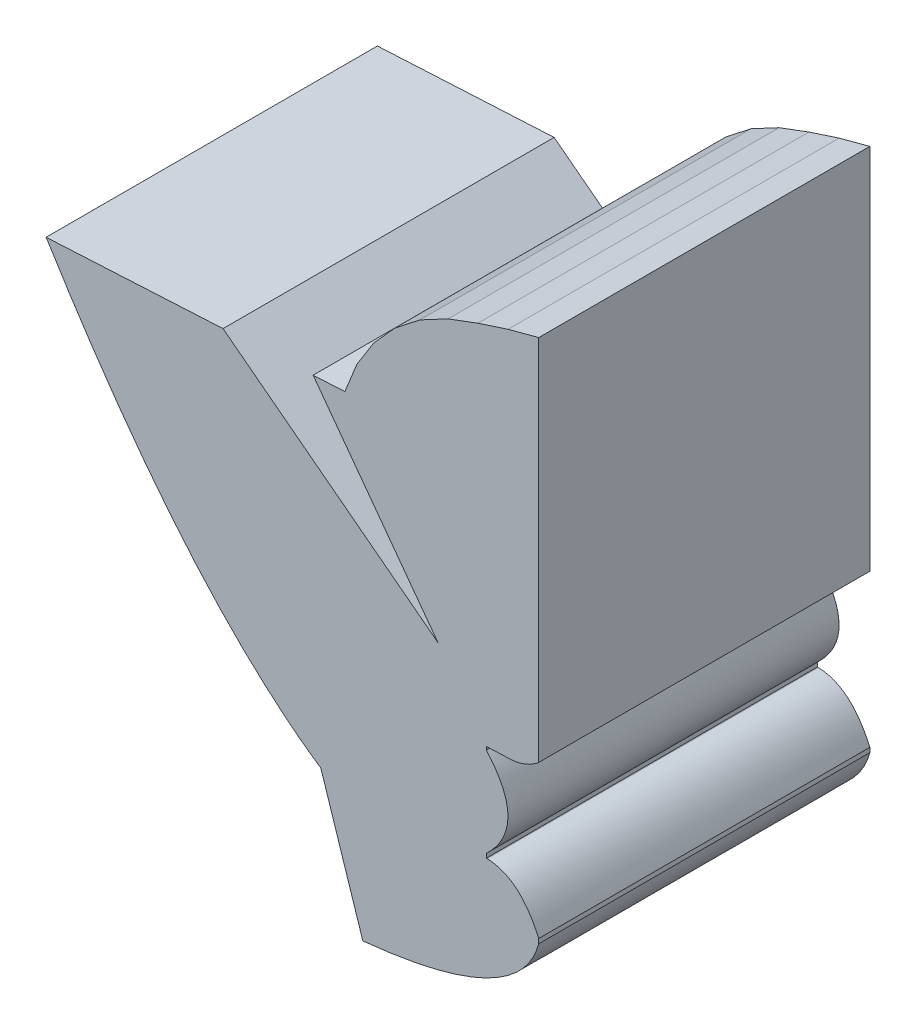
ISO-10303-21;
HEADER;
FILE_DESCRIPTION(('STEP AP214'),'2;1');
FILE_NAME('part.step','',(''),(''),'','','');
FILE_SCHEMA(('AUTOMOTIVE_DESIGN { 1 0 10303 214 1 1 1 1 }'));
ENDSEC;
DATA;
#1=APPLICATION_CONTEXT('core data for automotive mechanical design processes');
#2=APPLICATION_PROTOCOL_DEFINITION('international standard','automotive_design',2000,#1);
#3=PRODUCT_CONTEXT('',#1,'mechanical');
#4=PRODUCT('Part','Part','',(#3));
#5=PRODUCT_RELATED_PRODUCT_CATEGORY('part','',(#4));
#6=PRODUCT_DEFINITION_FORMATION('','',#4);
#7=PRODUCT_DEFINITION_CONTEXT('part definition',#1,'design');
#8=PRODUCT_DEFINITION('design','',#6,#7);
#9=PRODUCT_DEFINITION_SHAPE('','',#8);
#10=(LENGTH_UNIT() NAMED_UNIT(*) SI_UNIT(.MILLI.,.METRE.));
#11=(NAMED_UNIT(*) PLANE_ANGLE_UNIT() SI_UNIT($,.RADIAN.));
#12=(NAMED_UNIT(*) SI_UNIT($,.STERADIAN.) SOLID_ANGLE_UNIT());
#13=UNCERTAINTY_MEASURE_WITH_UNIT(LENGTH_MEASURE(1.E-05),#10,'distance_accuracy_value','');
#14=(GEOMETRIC_REPRESENTATION_CONTEXT(3) GLOBAL_UNCERTAINTY_ASSIGNED_CONTEXT((#13)) GLOBAL_UNIT_ASSIGNED_CONTEXT((#10,
#11,#12)) REPRESENTATION_CONTEXT('',''));
#15=CARTESIAN_POINT('',(0.,0.,0.));
#16=DIRECTION('',(0.,0.,1.));
#17=DIRECTION('',(1.,0.,0.));
#18=AXIS2_PLACEMENT_3D('',#15,#16,#17);
#19=CARTESIAN_POINT('',(-2.17733041778456,0.,7.21));
#20=DIRECTION('',(1.,0.,0.));
#21=DIRECTION('',(0.,1.,0.));
#22=AXIS2_PLACEMENT_3D('',#19,#20,#21);
#23=PLANE('',#22);
#24=DIRECTION('',(0.,1.,0.));
#25=VECTOR('',#24,1.);
#26=CARTESIAN_POINT('',(-2.17733041778456,0.,7.21));
#27=LINE('',#26,#25);
#28=CARTESIAN_POINT('',(-2.17733041779455,-1.68817652024789,7.21));
#29=VERTEX_POINT('',#28);
#30=CARTESIAN_POINT('',(-2.17733041778456,-1.87023854064238,7.21));
#31=VERTEX_POINT('',#30);
#32=EDGE_CURVE('E599',#29,#31,#27,.F.);
#33=ORIENTED_EDGE('',*,*,#32,.T.);
#34=DIRECTION('',(0.,0.,-1.));
#35=VECTOR('',#34,1.);
#36=CARTESIAN_POINT('',(-2.17733041778456,-1.87023854064238,7.21));
#37=LINE('',#36,#35);
#38=CARTESIAN_POINT('',(-2.17733041778456,-1.87023854064238,-7.21));
#39=VERTEX_POINT('',#38);
#40=EDGE_CURVE('E13',#31,#39,#37,.T.);
#41=ORIENTED_EDGE('',*,*,#40,.T.);
#42=DIRECTION('',(0.,1.,0.));
#43=VECTOR('',#42,1.);
#44=CARTESIAN_POINT('',(-2.17733041778456,0.,-7.21));
#45=LINE('',#44,#43);
#46=CARTESIAN_POINT('',(-2.17733041778456,-1.68817652020115,-7.21));
#47=VERTEX_POINT('',#46);
#48=EDGE_CURVE('E238',#47,#39,#45,.F.);
#49=ORIENTED_EDGE('',*,*,#48,.F.);
#50=DIRECTION('',(0.,0.,-1.));
#51=VECTOR('',#50,1.);
#52=CARTESIAN_POINT('',(-2.17733041778328,-1.68817652023794,33.5462369436587));
#53=LINE('',#52,#51);
#54=EDGE_CURVE('E693',#29,#47,#53,.T.);
#55=ORIENTED_EDGE('',*,*,#54,.F.);
#56=EDGE_LOOP('',(#33,#41,#49,#55));
#57=FACE_BOUND('',#56,.T.);
#58=ADVANCED_FACE('F59',(#57),#23,.T.);
#59=CARTESIAN_POINT('',(-82931.1005830976,996560.072871644,33.5462369436587));
#60=CARTESIAN_POINT('',(87153.8887538027,-996199.093812144,33.5462369436587));
#61=CARTESIAN_POINT('',(-91384.0928999308,995820.531871049,33.5462369436587));
#62=B_SPLINE_CURVE_WITH_KNOTS('',2,(#59,#60,#61),.UNSPECIFIED.,.F.,.F.,(3,3),(0.,1.),.UNSPECIFIED.);
#63=DIRECTION('',(0.,0.,-1.));
#64=VECTOR('',#63,1.);
#65=SURFACE_OF_LINEAR_EXTRUSION('',#62,#64);
#66=CARTESIAN_POINT('',(-10.3360060172452,-1.39847805122074,-7.21));
#67=CARTESIAN_POINT('',(-9.86107716648297,-1.76023759043423,-7.21));
#68=CARTESIAN_POINT('',(-9.38992513536285,-2.07882788360003,-7.21));
#69=B_SPLINE_CURVE_WITH_KNOTS('',2,(#66,#67,#68),.UNSPECIFIED.,.F.,.F.,(3,3),(0.500860940724971,
0.500965025000386),.UNSPECIFIED.);
#70=CARTESIAN_POINT('',(-10.3360060157351,-1.39847805238491,-7.21253661762446));
#71=VERTEX_POINT('',#70);
#72=CARTESIAN_POINT('',(-9.38992513448754,-2.07882788384246,-7.21));
#73=VERTEX_POINT('',#72);
#74=EDGE_CURVE('E627',#71,#73,#69,.T.);
#75=ORIENTED_EDGE('',*,*,#74,.T.);
#76=DIRECTION('',(0.,0.,-1.));
#77=VECTOR('',#76,1.);
#78=CARTESIAN_POINT('',(-9.38992513433434,-2.07882788430969,0.));
#79=LINE('',#78,#77);
#80=CARTESIAN_POINT('',(-9.38992513537839,-2.07882788359217,7.21));
#81=VERTEX_POINT('',#80);
#82=EDGE_CURVE('E61',#73,#81,#79,.F.);
#83=ORIENTED_EDGE('',*,*,#82,.T.);
#84=CARTESIAN_POINT('',(-9.38992513537751,-2.07882788359004,7.21));
#85=CARTESIAN_POINT('',(-9.86107716655748,-1.76023759038315,7.21));
#86=CARTESIAN_POINT('',(-10.3360060173805,-1.39847805111761,7.21));
#87=B_SPLINE_CURVE_WITH_KNOTS('',2,(#84,#85,#86),.UNSPECIFIED.,.F.,.F.,(3,3),(0.500860940724973,
0.500965025000401),.UNSPECIFIED.);
#88=CARTESIAN_POINT('',(-10.3360060166126,-1.39847805171673,7.21251805157951));
#89=VERTEX_POINT('',#88);
#90=EDGE_CURVE('E557',#89,#81,#87,.F.);
#91=ORIENTED_EDGE('',*,*,#90,.F.);
#92=CARTESIAN_POINT('',(-10.336006015861,-1.39847805228632,7.21));
#93=CARTESIAN_POINT('',(-10.6228848167366,-1.17995870432205,7.21));
#94=CARTESIAN_POINT('',(-10.9111416710362,-0.945688133646021,7.21));
#95=B_SPLINE_CURVE_WITH_KNOTS('',2,(#92,#93,#94),.UNSPECIFIED.,.F.,.F.,(3,3),(0.500965025000234,
0.501027896674745),.UNSPECIFIED.);
#96=CARTESIAN_POINT('',(-10.9111416711017,-0.945688133589869,7.21251805157951));
#97=VERTEX_POINT('',#96);
#98=EDGE_CURVE('E503',#97,#89,#95,.F.);
#99=ORIENTED_EDGE('',*,*,#98,.F.);
#100=CARTESIAN_POINT('',(-10.9111416711622,-0.945688133537792,7.21));
#101=CARTESIAN_POINT('',(-15.9223301717882,3.1269782135513,7.20999999999999));
#102=CARTESIAN_POINT('',(-21.3499930113534,11.9599680374731,7.20999999999999));
#103=B_SPLINE_CURVE_WITH_KNOTS('',2,(#100,#101,#102),.UNSPECIFIED.,.F.,.F.,(3,3),
(0.50102789667476,0.50212088651222),.UNSPECIFIED.);
#104=CARTESIAN_POINT('',(-21.3499930113618,11.9599680374759,7.21251805157951));
#105=VERTEX_POINT('',#104);
#106=EDGE_CURVE('E571',#105,#97,#103,.F.);
#107=ORIENTED_EDGE('',*,*,#106,.F.);
#108=DIRECTION('',(0.,0.,1.));
#109=VECTOR('',#108,1.);
#110=CARTESIAN_POINT('',(-21.3499930113609,11.9599680374713,-7.21507323524891));
#111=LINE('',#110,#109);
#112=CARTESIAN_POINT('',(-21.3499930113604,11.959968037476,-7.21253661762445));
#113=VERTEX_POINT('',#112);
#114=EDGE_CURVE('E647',#113,#105,#111,.T.);
#115=ORIENTED_EDGE('',*,*,#114,.F.);
#116=CARTESIAN_POINT('',(-21.3499930113554,11.9599680374539,-7.21));
#117=CARTESIAN_POINT('',(-15.9223301719088,3.12697821372485,-7.21));
#118=CARTESIAN_POINT('',(-10.9111416713832,-0.945688133379363,-7.21));
#119=B_SPLINE_CURVE_WITH_KNOTS('',2,(#116,#117,#118),.UNSPECIFIED.,.F.,.F.,(3,3),
(0.501027896674784,0.50212088651222),.UNSPECIFIED.);
#120=CARTESIAN_POINT('',(-10.9111416712647,-0.945688133456589,-7.21253661762446));
#121=VERTEX_POINT('',#120);
#122=EDGE_CURVE('E550',#113,#121,#119,.T.);
#123=ORIENTED_EDGE('',*,*,#122,.T.);
#124=CARTESIAN_POINT('',(-10.9111416712668,-0.945688133461656,-7.21));
#125=CARTESIAN_POINT('',(-10.622884816787,-1.17995870429009,-7.21));
#126=CARTESIAN_POINT('',(-10.3360060157329,-1.39847805238713,-7.21));
#127=B_SPLINE_CURVE_WITH_KNOTS('',2,(#124,#125,#126),.UNSPECIFIED.,.F.,.F.,(3,3),
(0.50096502500022,0.501027896674771),.UNSPECIFIED.);
#128=EDGE_CURVE('E493',#121,#71,#127,.T.);
#129=ORIENTED_EDGE('',*,*,#128,.T.);
#130=EDGE_LOOP('',(#75,#83,#91,#99,#107,#115,#123,#129));
#131=FACE_BOUND('',#130,.T.);
#132=ADVANCED_FACE('F463',(#131),#65,.T.);
#133=DIRECTION('',(0.,1.,0.));
#134=VECTOR('',#133,1.);
#135=CARTESIAN_POINT('',(-2.17733041778456,0.,-7.21));
#136=LINE('',#135,#134);
#137=CARTESIAN_POINT('',(-2.17733041778456,2.34248700715526,-7.21));
#138=VERTEX_POINT('',#137);
#139=CARTESIAN_POINT('',(-2.17733041777607,2.20172974209443,-7.21));
#140=VERTEX_POINT('',#139);
#141=EDGE_CURVE('E582',#138,#140,#136,.F.);
#142=ORIENTED_EDGE('',*,*,#141,.F.);
#143=DIRECTION('',(0.,0.,-1.));
#144=VECTOR('',#143,1.);
#145=CARTESIAN_POINT('',(-2.17733041778456,2.34248700715526,26.4637698053972));
#146=LINE('',#145,#144);
#147=CARTESIAN_POINT('',(-2.17733041778456,2.34248700715526,7.21));
#148=VERTEX_POINT('',#147);
#149=EDGE_CURVE('E387',#148,#138,#146,.T.);
#150=ORIENTED_EDGE('',*,*,#149,.F.);
#151=DIRECTION('',(0.,1.,0.));
#152=VECTOR('',#151,1.);
#153=CARTESIAN_POINT('',(-2.17733041778456,0.,7.21));
#154=LINE('',#153,#152);
#155=CARTESIAN_POINT('',(-2.17733041778074,2.20172974210003,7.21));
#156=VERTEX_POINT('',#155);
#157=EDGE_CURVE('E591',#148,#156,#154,.F.);
#158=ORIENTED_EDGE('',*,*,#157,.T.);
#159=DIRECTION('',(0.,0.,-1.));
#160=VECTOR('',#159,1.);
#161=CARTESIAN_POINT('',(-2.17733041778074,2.20172974210003,33.5462369436587));
#162=LINE('',#161,#160);
#163=EDGE_CURVE('E692',#156,#140,#162,.T.);
#164=ORIENTED_EDGE('',*,*,#163,.T.);
#165=EDGE_LOOP('',(#142,#150,#158,#164));
#166=FACE_BOUND('',#165,.T.);
#167=ADVANCED_FACE('F456',(#166),#23,.T.);
#168=CARTESIAN_POINT('',(-13.6496127625312,12.3635278659567,-7.21507323524891));
#169=DIRECTION('',(0.607599018477342,0.794243937808386,0.));
#170=DIRECTION('',(-0.794243937808386,0.607599018477342,0.));
#171=AXIS2_PLACEMENT_3D('',#168,#169,#170);
#172=PLANE('',#171);
#173=DIRECTION('',(-0.794243937808386,0.607599018477342,0.));
#174=VECTOR('',#173,1.);
#175=CARTESIAN_POINT('',(-2.17733041778456,3.58719711850737,7.21));
#176=LINE('',#175,#174);
#177=CARTESIAN_POINT('',(-4.28688263587392,5.20101095594709,7.21));
#178=VERTEX_POINT('',#177);
#179=CARTESIAN_POINT('',(-13.6496127625312,12.3635278659567,7.21));
#180=VERTEX_POINT('',#179);
#181=EDGE_CURVE('E326',#178,#180,#176,.T.);
#182=ORIENTED_EDGE('',*,*,#181,.F.);
#183=DIRECTION('',(0.,0.,-1.));
#184=VECTOR('',#183,1.);
#185=CARTESIAN_POINT('',(-4.28688263587392,5.2010109559471,-7.21507323524891));
#186=LINE('',#185,#184);
#187=CARTESIAN_POINT('',(-4.28688263587394,5.20101095594711,-7.21));
#188=VERTEX_POINT('',#187);
#189=EDGE_CURVE('E592',#178,#188,#186,.T.);
#190=ORIENTED_EDGE('',*,*,#189,.T.);
#191=DIRECTION('',(-0.794243937808386,0.607599018477342,0.));
#192=VECTOR('',#191,1.);
#193=CARTESIAN_POINT('',(0.927296805871271,1.21214788736496,-7.21));
#194=LINE('',#193,#192);
#195=CARTESIAN_POINT('',(-13.6496127625312,12.3635278659567,-7.21));
#196=VERTEX_POINT('',#195);
#197=EDGE_CURVE('E574',#188,#196,#194,.T.);
#198=ORIENTED_EDGE('',*,*,#197,.T.);
#199=DIRECTION('',(0.,0.,1.));
#200=VECTOR('',#199,1.);
#201=CARTESIAN_POINT('',(-13.6496127625312,12.3635278659567,-7.21507323524891));
#202=LINE('',#201,#200);
#203=EDGE_CURVE('E397',#196,#180,#202,.T.);
#204=ORIENTED_EDGE('',*,*,#203,.T.);
#205=EDGE_LOOP('',(#182,#190,#198,#204));
#206=FACE_BOUND('',#205,.T.);
#207=ADVANCED_FACE('F451',(#206),#172,.T.);
#208=CARTESIAN_POINT('',(-0.683557287645435,13.0430500394562,7.21));
#209=DIRECTION('',(0.0523359562429403,-0.998629534754574,0.));
#210=DIRECTION('',(0.998629534754574,0.0523359562429403,0.));
#211=AXIS2_PLACEMENT_3D('',#208,#209,#210);
#212=PLANE('',#211);
#213=ORIENTED_EDGE('',*,*,#203,.F.);
#214=DIRECTION('',(0.998629534754574,0.0523359562429403,0.));
#215=VECTOR('',#214,1.);
#216=CARTESIAN_POINT('',(-0.683557287645435,13.0430500394562,-7.21));
#217=LINE('',#216,#215);
#218=EDGE_CURVE('E590',#196,#113,#217,.F.);
#219=ORIENTED_EDGE('',*,*,#218,.T.);
#220=ORIENTED_EDGE('',*,*,#114,.T.);
#221=DIRECTION('',(-0.998629534754574,-0.0523359562429403,0.));
#222=VECTOR('',#221,1.);
#223=CARTESIAN_POINT('',(-8.98184569452944,12.6081551722012,7.21));
#224=LINE('',#223,#222);
#225=EDGE_CURVE('E596',#180,#105,#224,.T.);
#226=ORIENTED_EDGE('',*,*,#225,.F.);
#227=EDGE_LOOP('',(#213,#219,#220,#226));
#228=FACE_BOUND('',#227,.T.);
#229=ADVANCED_FACE('F460',(#228),#212,.F.);
#230=CARTESIAN_POINT('',(0.,0.,7.21));
#231=DIRECTION('',(0.,0.,1.));
#232=DIRECTION('',(1.,0.,0.));
#233=AXIS2_PLACEMENT_3D('',#230,#231,#232);
#234=PLANE('',#233);
#235=ORIENTED_EDGE('',*,*,#90,.T.);
#236=DIRECTION('',(0.310244434689086,-0.950656820700535,0.));
#237=VECTOR('',#236,1.);
#238=CARTESIAN_POINT('',(-10.0196416475403,-0.149238723471877,7.21));
#239=LINE('',#238,#237);
#240=CARTESIAN_POINT('',(-7.56050506337814,-7.6845712077139,7.21));
#241=VERTEX_POINT('',#240);
#242=EDGE_CURVE('E74',#81,#241,#239,.T.);
#243=ORIENTED_EDGE('',*,*,#242,.T.);
#244=CARTESIAN_POINT('',(-933106.759380235,359603.535751917,7.21));
#245=CARTESIAN_POINT('',(932220.302324774,-361895.565336198,7.21));
#246=CARTESIAN_POINT('',(-931333.861410854,364170.463908804,7.21));
#247=B_SPLINE_CURVE_WITH_KNOTS('',2,(#244,#245,#246),.UNSPECIFIED.,.F.,.F.,(3,3),(0.,1.),.UNSPECIFIED.);
#248=CARTESIAN_POINT('',(0.100000006212991,-3.96279092132878,7.21));
#249=VERTEX_POINT('',#248);
#250=EDGE_CURVE('E261',#241,#249,#247,.T.);
#251=ORIENTED_EDGE('',*,*,#250,.T.);
#252=DIRECTION('',(2.22058157456749E-12,1.,0.));
#253=VECTOR('',#252,1.);
#254=CARTESIAN_POINT('',(0.100000000000933,-3.76279094455367,7.21));
#255=LINE('',#254,#253);
#256=CARTESIAN_POINT('',(0.100000000000933,-3.76279094455367,7.21));
#257=VERTEX_POINT('',#256);
#258=EDGE_CURVE('E720',#249,#257,#255,.T.);
#259=ORIENTED_EDGE('',*,*,#258,.T.);
#260=CARTESIAN_POINT('',(-340142.258084091,-940378.661072562,7.21));
#261=CARTESIAN_POINT('',(342018.643325663,939690.620785911,7.21));
#262=CARTESIAN_POINT('',(-343901.028567235,-939010.58049926,7.21));
#263=B_SPLINE_CURVE_WITH_KNOTS('',2,(#260,#261,#262),.UNSPECIFIED.,.F.,.F.,(3,3),(0.,1.),.UNSPECIFIED.);
#264=CARTESIAN_POINT('',(-2.14675730902949,-1.87694782736109,7.21));
#265=VERTEX_POINT('',#264);
#266=EDGE_CURVE('E719',#257,#265,#263,.T.);
#267=ORIENTED_EDGE('',*,*,#266,.T.);
#268=DIRECTION('',(-0.976756943268694,0.21434988634566,0.));
#269=VECTOR('',#268,1.);
#270=CARTESIAN_POINT('',(-2.14675730902949,-1.87694782736109,7.21));
#271=LINE('',#270,#269);
#272=EDGE_CURVE('E246',#265,#31,#271,.T.);
#273=ORIENTED_EDGE('',*,*,#272,.T.);
#274=ORIENTED_EDGE('',*,*,#32,.F.);
#275=CARTESIAN_POINT('',(-2.17733041777607,2.20172974209443,7.21));
#276=CARTESIAN_POINT('',(-0.307419303310444,0.0931805865995528,7.21));
#277=CARTESIAN_POINT('',(-2.17733041779435,-1.68817652026,7.21));
#278=B_SPLINE_CURVE_WITH_KNOTS('',2,(#275,#276,#277),.UNSPECIFIED.,.F.,.F.,(3,3),
(0.49947186766891,0.500440643667569),.UNSPECIFIED.);
#279=EDGE_CURVE('E688',#156,#29,#278,.T.);
#280=ORIENTED_EDGE('',*,*,#279,.F.);
#281=ORIENTED_EDGE('',*,*,#157,.F.);
#282=DIRECTION('',(0.999390827019096,0.0348994967025048,0.));
#283=VECTOR('',#282,1.);
#284=CARTESIAN_POINT('',(-2.17733041778456,2.34248700715526,7.21));
#285=LINE('',#284,#283);
#286=CARTESIAN_POINT('',(-1.19050164048462,2.37694782742692,7.21));
#287=VERTEX_POINT('',#286);
#288=EDGE_CURVE('E328',#148,#287,#285,.T.);
#289=ORIENTED_EDGE('',*,*,#288,.T.);
#290=CARTESIAN_POINT('',(-343900.072311573,939011.080499257,7.21));
#291=CARTESIAN_POINT('',(342019.599581338,-939690.120785908,7.21));
#292=CARTESIAN_POINT('',(-340141.301828429,940379.16107256,7.21));
#293=B_SPLINE_CURVE_WITH_KNOTS('',2,(#290,#291,#292),.UNSPECIFIED.,.F.,.F.,(3,3),(0.,1.),.UNSPECIFIED.);
#294=CARTESIAN_POINT('',(0.100000000004221,2.87767341815847,7.21));
#295=VERTEX_POINT('',#294);
#296=EDGE_CURVE('E325',#287,#295,#293,.T.);
#297=ORIENTED_EDGE('',*,*,#296,.T.);
#298=DIRECTION('',(0.,1.,0.));
#299=VECTOR('',#298,1.);
#300=CARTESIAN_POINT('',(0.100000000004221,2.87767341815847,7.21));
#301=LINE('',#300,#299);
#302=CARTESIAN_POINT('',(0.100000000004749,18.901056981292,7.21));
#303=VERTEX_POINT('',#302);
#304=EDGE_CURVE('E366',#295,#303,#301,.T.);
#305=ORIENTED_EDGE('',*,*,#304,.T.);
#306=DIRECTION('',(-0.965925826289069,-0.258819045102517,0.));
#307=VECTOR('',#306,1.);
#308=CARTESIAN_POINT('',(-1.23717113969405,18.5427630542675,7.21));
#309=LINE('',#308,#307);
#310=CARTESIAN_POINT('',(-1.23717113969405,18.5427630542675,7.21));
#311=VERTEX_POINT('',#310);
#312=EDGE_CURVE('E361',#303,#311,#309,.T.);
#313=ORIENTED_EDGE('',*,*,#312,.T.);
#314=DIRECTION('',(-0.951056516295155,-0.309016994374945,0.));
#315=VECTOR('',#314,1.);
#316=CARTESIAN_POINT('',(-2.55375807753184,18.114978026361,7.21));
#317=LINE('',#316,#315);
#318=CARTESIAN_POINT('',(-2.55375807753184,18.114978026361,7.21));
#319=VERTEX_POINT('',#318);
#320=EDGE_CURVE('E359',#311,#319,#317,.T.);
#321=ORIENTED_EDGE('',*,*,#320,.T.);
#322=DIRECTION('',(-0.9366721892484,-0.35020738125946,0.));
#323=VECTOR('',#322,1.);
#324=CARTESIAN_POINT('',(-3.85043219549524,17.63017143937,7.21));
#325=LINE('',#324,#323);
#326=CARTESIAN_POINT('',(-3.85043219549524,17.63017143937,7.21));
#327=VERTEX_POINT('',#326);
#328=EDGE_CURVE('E357',#319,#327,#325,.T.);
#329=ORIENTED_EDGE('',*,*,#328,.T.);
#330=DIRECTION('',(-0.882947592859008,-0.469471562785738,0.));
#331=VECTOR('',#330,1.);
#332=CARTESIAN_POINT('',(-5.07273312886345,16.9802625047698,7.21));
#333=LINE('',#332,#331);
#334=CARTESIAN_POINT('',(-5.07273312886345,16.9802625047698,7.21));
#335=VERTEX_POINT('',#334);
#336=EDGE_CURVE('E353',#327,#335,#333,.T.);
#337=ORIENTED_EDGE('',*,*,#336,.T.);
#338=DIRECTION('',(-0.788010753606726,-0.615661475325653,0.));
#339=VECTOR('',#338,1.);
#340=CARTESIAN_POINT('',(-6.1636090624156,16.1279768175834,7.21));
#341=LINE('',#340,#339);
#342=CARTESIAN_POINT('',(-6.1636090624156,16.1279768175834,7.21));
#343=VERTEX_POINT('',#342);
#344=EDGE_CURVE('E351',#335,#343,#341,.T.);
#345=ORIENTED_EDGE('',*,*,#344,.T.);
#346=DIRECTION('',(-0.669130606358526,-0.743144825477693,0.));
#347=VECTOR('',#346,1.);
#348=CARTESIAN_POINT('',(-7.08991428292019,15.0992106471385,7.21));
#349=LINE('',#348,#347);
#350=CARTESIAN_POINT('',(-7.08991428292019,15.0992106471385,7.21));
#351=VERTEX_POINT('',#350);
#352=EDGE_CURVE('E350',#343,#351,#349,.T.);
#353=ORIENTED_EDGE('',*,*,#352,.T.);
#354=DIRECTION('',(-0.52991926423321,-0.848048096156423,0.));
#355=VECTOR('',#354,1.);
#356=CARTESIAN_POINT('',(-7.82350347498618,13.925222532944,7.21));
#357=LINE('',#356,#355);
#358=CARTESIAN_POINT('',(-7.82350347498618,13.925222532944,7.21));
#359=VERTEX_POINT('',#358);
#360=EDGE_CURVE('E341',#351,#359,#357,.T.);
#361=ORIENTED_EDGE('',*,*,#360,.T.);
#362=DIRECTION('',(-0.374606593415918,-0.927183854566785,0.));
#363=VECTOR('',#362,1.);
#364=CARTESIAN_POINT('',(-8.34208690222621,12.6416835097826,7.21));
#365=LINE('',#364,#363);
#366=CARTESIAN_POINT('',(-8.34208690222621,12.6416835097826,7.21));
#367=VERTEX_POINT('',#366);
#368=EDGE_CURVE('E344',#359,#367,#365,.T.);
#369=ORIENTED_EDGE('',*,*,#368,.T.);
#370=DIRECTION('',(-0.998629534754663,-0.0523359562412363,0.));
#371=VECTOR('',#370,1.);
#372=CARTESIAN_POINT('',(-9.72453114050486,12.5692326772742,7.21));
#373=LINE('',#372,#371);
#374=CARTESIAN_POINT('',(-9.72453114050486,12.5692326772742,7.21));
#375=VERTEX_POINT('',#374);
#376=EDGE_CURVE('E339',#367,#375,#373,.T.);
#377=ORIENTED_EDGE('',*,*,#376,.T.);
#378=DIRECTION('',(0.593795682495491,-0.804615863284906,0.));
#379=VECTOR('',#378,1.);
#380=CARTESIAN_POINT('',(-9.72453114050486,12.5692326772742,7.21));
#381=LINE('',#380,#379);
#382=EDGE_CURVE('E337',#375,#178,#381,.T.);
#383=ORIENTED_EDGE('',*,*,#382,.T.);
#384=ORIENTED_EDGE('',*,*,#181,.T.);
#385=ORIENTED_EDGE('',*,*,#225,.T.);
#386=ORIENTED_EDGE('',*,*,#106,.T.);
#387=ORIENTED_EDGE('',*,*,#98,.T.);
#388=EDGE_LOOP('',(#235,#243,#251,#259,#267,#273,#274,#280,#281,#289,#297,#305,#313,#321,#329,
#337,#345,#353,#361,#369,#377,#383,#384,#385,#386,#387));
#389=FACE_BOUND('',#388,.T.);
#390=ADVANCED_FACE('F528',(#389),#234,.T.);
#391=CARTESIAN_POINT('',(0.,0.,-7.21));
#392=DIRECTION('',(0.,0.,1.));
#393=DIRECTION('',(1.,0.,0.));
#394=AXIS2_PLACEMENT_3D('',#391,#392,#393);
#395=PLANE('',#394);
#396=ORIENTED_EDGE('',*,*,#48,.T.);
#397=DIRECTION('',(0.976756943268694,-0.21434988634566,0.));
#398=VECTOR('',#397,1.);
#399=CARTESIAN_POINT('',(-2.14675730902949,-1.87694782736109,-7.21));
#400=LINE('',#399,#398);
#401=CARTESIAN_POINT('',(-2.14675730902949,-1.87694782736109,-7.21));
#402=VERTEX_POINT('',#401);
#403=EDGE_CURVE('E229',#39,#402,#400,.T.);
#404=ORIENTED_EDGE('',*,*,#403,.T.);
#405=CARTESIAN_POINT('',(-340142.258084091,-940378.661072562,-7.21));
#406=CARTESIAN_POINT('',(342018.643325663,939690.620785911,-7.21));
#407=CARTESIAN_POINT('',(-343901.028567235,-939010.58049926,-7.21));
#408=B_SPLINE_CURVE_WITH_KNOTS('',2,(#405,#406,#407),.UNSPECIFIED.,.F.,.F.,(3,3),(0.,1.),.UNSPECIFIED.);
#409=CARTESIAN_POINT('',(0.100000000000933,-3.76279094455367,-7.21));
#410=VERTEX_POINT('',#409);
#411=EDGE_CURVE('E232',#402,#410,#408,.F.);
#412=ORIENTED_EDGE('',*,*,#411,.T.);
#413=DIRECTION('',(-2.22058157456749E-12,-1.,0.));
#414=VECTOR('',#413,1.);
#415=CARTESIAN_POINT('',(0.100000000000933,-3.76279094455367,-7.21));
#416=LINE('',#415,#414);
#417=CARTESIAN_POINT('',(0.100000006214185,-3.96279092132124,-7.21));
#418=VERTEX_POINT('',#417);
#419=EDGE_CURVE('E254',#410,#418,#416,.T.);
#420=ORIENTED_EDGE('',*,*,#419,.T.);
#421=CARTESIAN_POINT('',(-933106.759380235,359603.535751917,-7.21));
#422=CARTESIAN_POINT('',(932220.302324774,-361895.565336198,-7.21));
#423=CARTESIAN_POINT('',(-931333.861410854,364170.463908804,-7.21));
#424=B_SPLINE_CURVE_WITH_KNOTS('',2,(#421,#422,#423),.UNSPECIFIED.,.F.,.F.,(3,3),(0.,1.),.UNSPECIFIED.);
#425=CARTESIAN_POINT('',(-7.56050506337814,-7.6845712077139,-7.21));
#426=VERTEX_POINT('',#425);
#427=EDGE_CURVE('E253',#418,#426,#424,.F.);
#428=ORIENTED_EDGE('',*,*,#427,.T.);
#429=DIRECTION('',(-0.310244434689086,0.950656820700535,0.));
#430=VECTOR('',#429,1.);
#431=CARTESIAN_POINT('',(-10.0196416475403,-0.149238723471877,-7.21));
#432=LINE('',#431,#430);
#433=EDGE_CURVE('E280',#426,#73,#432,.T.);
#434=ORIENTED_EDGE('',*,*,#433,.T.);
#435=ORIENTED_EDGE('',*,*,#74,.F.);
#436=ORIENTED_EDGE('',*,*,#128,.F.);
#437=ORIENTED_EDGE('',*,*,#122,.F.);
#438=ORIENTED_EDGE('',*,*,#218,.F.);
#439=ORIENTED_EDGE('',*,*,#197,.F.);
#440=DIRECTION('',(-0.593795682495491,0.804615863284906,0.));
#441=VECTOR('',#440,1.);
#442=CARTESIAN_POINT('',(-9.72453114050486,12.5692326772742,-7.21));
#443=LINE('',#442,#441);
#444=CARTESIAN_POINT('',(-9.72453114050486,12.5692326772742,-7.21));
#445=VERTEX_POINT('',#444);
#446=EDGE_CURVE('E78',#188,#445,#443,.T.);
#447=ORIENTED_EDGE('',*,*,#446,.T.);
#448=DIRECTION('',(0.998629534754663,0.0523359562412363,0.));
#449=VECTOR('',#448,1.);
#450=CARTESIAN_POINT('',(-9.72453114050486,12.5692326772742,-7.21));
#451=LINE('',#450,#449);
#452=CARTESIAN_POINT('',(-8.34208690222621,12.6416835097826,-7.21));
#453=VERTEX_POINT('',#452);
#454=EDGE_CURVE('E299',#445,#453,#451,.T.);
#455=ORIENTED_EDGE('',*,*,#454,.T.);
#456=DIRECTION('',(0.374606593415918,0.927183854566785,0.));
#457=VECTOR('',#456,1.);
#458=CARTESIAN_POINT('',(-8.34208690222621,12.6416835097826,-7.21));
#459=LINE('',#458,#457);
#460=CARTESIAN_POINT('',(-7.82350347498618,13.925222532944,-7.21));
#461=VERTEX_POINT('',#460);
#462=EDGE_CURVE('E298',#453,#461,#459,.T.);
#463=ORIENTED_EDGE('',*,*,#462,.T.);
#464=DIRECTION('',(0.52991926423321,0.848048096156423,0.));
#465=VECTOR('',#464,1.);
#466=CARTESIAN_POINT('',(-7.82350347498618,13.925222532944,-7.21));
#467=LINE('',#466,#465);
#468=CARTESIAN_POINT('',(-7.08991428292019,15.0992106471385,-7.21));
#469=VERTEX_POINT('',#468);
#470=EDGE_CURVE('E291',#461,#469,#467,.T.);
#471=ORIENTED_EDGE('',*,*,#470,.T.);
#472=DIRECTION('',(0.669130606358526,0.743144825477693,0.));
#473=VECTOR('',#472,1.);
#474=CARTESIAN_POINT('',(-7.08991428292019,15.0992106471385,-7.21));
#475=LINE('',#474,#473);
#476=CARTESIAN_POINT('',(-6.1636090624156,16.1279768175834,-7.21));
#477=VERTEX_POINT('',#476);
#478=EDGE_CURVE('E289',#469,#477,#475,.T.);
#479=ORIENTED_EDGE('',*,*,#478,.T.);
#480=DIRECTION('',(0.788010753606726,0.615661475325653,0.));
#481=VECTOR('',#480,1.);
#482=CARTESIAN_POINT('',(-6.1636090624156,16.1279768175834,-7.21));
#483=LINE('',#482,#481);
#484=CARTESIAN_POINT('',(-5.07273312886345,16.9802625047698,-7.21));
#485=VERTEX_POINT('',#484);
#486=EDGE_CURVE('E290',#477,#485,#483,.T.);
#487=ORIENTED_EDGE('',*,*,#486,.T.);
#488=DIRECTION('',(0.882947592859008,0.469471562785738,0.));
#489=VECTOR('',#488,1.);
#490=CARTESIAN_POINT('',(-5.07273312886345,16.9802625047698,-7.21));
#491=LINE('',#490,#489);
#492=CARTESIAN_POINT('',(-3.85043219549524,17.63017143937,-7.21));
#493=VERTEX_POINT('',#492);
#494=EDGE_CURVE('E281',#485,#493,#491,.T.);
#495=ORIENTED_EDGE('',*,*,#494,.T.);
#496=DIRECTION('',(0.9366721892484,0.35020738125946,0.));
#497=VECTOR('',#496,1.);
#498=CARTESIAN_POINT('',(-3.85043219549524,17.63017143937,-7.21));
#499=LINE('',#498,#497);
#500=CARTESIAN_POINT('',(-2.55375807753184,18.114978026361,-7.21));
#501=VERTEX_POINT('',#500);
#502=EDGE_CURVE('E270',#493,#501,#499,.T.);
#503=ORIENTED_EDGE('',*,*,#502,.T.);
#504=DIRECTION('',(0.951056516295155,0.309016994374945,0.));
#505=VECTOR('',#504,1.);
#506=CARTESIAN_POINT('',(-2.55375807753184,18.114978026361,-7.21));
#507=LINE('',#506,#505);
#508=CARTESIAN_POINT('',(-1.23717113969405,18.5427630542675,-7.21));
#509=VERTEX_POINT('',#508);
#510=EDGE_CURVE('E318',#501,#509,#507,.T.);
#511=ORIENTED_EDGE('',*,*,#510,.T.);
#512=DIRECTION('',(0.965925826289069,0.258819045102517,0.));
#513=VECTOR('',#512,1.);
#514=CARTESIAN_POINT('',(-1.23717113969405,18.5427630542675,-7.21));
#515=LINE('',#514,#513);
#516=CARTESIAN_POINT('',(0.100000000004749,18.901056981292,-7.21));
#517=VERTEX_POINT('',#516);
#518=EDGE_CURVE('E320',#509,#517,#515,.T.);
#519=ORIENTED_EDGE('',*,*,#518,.T.);
#520=DIRECTION('',(0.,-1.,0.));
#521=VECTOR('',#520,1.);
#522=CARTESIAN_POINT('',(0.100000000004221,2.87767341815847,-7.21));
#523=LINE('',#522,#521);
#524=CARTESIAN_POINT('',(0.0999999999995449,2.8776734181557,-7.21));
#525=VERTEX_POINT('',#524);
#526=EDGE_CURVE('E311',#517,#525,#523,.T.);
#527=ORIENTED_EDGE('',*,*,#526,.T.);
#528=CARTESIAN_POINT('',(-343900.072311573,939011.080499257,-7.21));
#529=CARTESIAN_POINT('',(342019.599581338,-939690.120785908,-7.21));
#530=CARTESIAN_POINT('',(-340141.301828429,940379.16107256,-7.21));
#531=B_SPLINE_CURVE_WITH_KNOTS('',2,(#528,#529,#530),.UNSPECIFIED.,.F.,.F.,(3,3),(0.,1.),.UNSPECIFIED.);
#532=CARTESIAN_POINT('',(-1.19050164048462,2.37694782741517,-7.21));
#533=VERTEX_POINT('',#532);
#534=EDGE_CURVE('E306',#525,#533,#531,.F.);
#535=ORIENTED_EDGE('',*,*,#534,.T.);
#536=DIRECTION('',(-0.999390827019096,-0.0348994967025048,0.));
#537=VECTOR('',#536,1.);
#538=CARTESIAN_POINT('',(-2.17733041778456,2.34248700715526,-7.21));
#539=LINE('',#538,#537);
#540=EDGE_CURVE('E303',#533,#138,#539,.T.);
#541=ORIENTED_EDGE('',*,*,#540,.T.);
#542=ORIENTED_EDGE('',*,*,#141,.T.);
#543=CARTESIAN_POINT('',(-2.17733041776379,-1.68817652023098,-7.21));
#544=CARTESIAN_POINT('',(-0.307419303328964,0.0931805866132554,-7.21));
#545=CARTESIAN_POINT('',(-2.17733041776824,2.20172974208621,-7.21));
#546=B_SPLINE_CURVE_WITH_KNOTS('',2,(#543,#544,#545),.UNSPECIFIED.,.F.,.F.,(3,3),
(0.499471867668912,0.500440643667561),.UNSPECIFIED.);
#547=EDGE_CURVE('E698',#47,#140,#546,.T.);
#548=ORIENTED_EDGE('',*,*,#547,.F.);
#549=EDGE_LOOP('',(#396,#404,#412,#420,#428,#434,#435,#436,#437,#438,#439,#447,#455,#463,#471,
#479,#487,#495,#503,#511,#519,#527,#535,#541,#542,#548));
#550=FACE_BOUND('',#549,.T.);
#551=ADVANCED_FACE('F235',(#550),#395,.F.);
#552=CARTESIAN_POINT('',(-996021.636606251,89148.1321438377,33.5462369436587));
#553=CARTESIAN_POINT('',(996193.448091746,-87155.7427476542,33.5462369436587));
#554=CARTESIAN_POINT('',(-996370.259577241,85163.3533514707,33.5462369436587));
#555=B_SPLINE_CURVE_WITH_KNOTS('',2,(#552,#553,#554),.UNSPECIFIED.,.F.,.F.,(3,3),(0.,1.),.UNSPECIFIED.);
#556=DIRECTION('',(0.,0.,-1.));
#557=VECTOR('',#556,1.);
#558=SURFACE_OF_LINEAR_EXTRUSION('',#555,#557);
#559=ORIENTED_EDGE('',*,*,#163,.F.);
#560=ORIENTED_EDGE('',*,*,#279,.T.);
#561=ORIENTED_EDGE('',*,*,#54,.T.);
#562=ORIENTED_EDGE('',*,*,#547,.T.);
#563=EDGE_LOOP('',(#559,#560,#561,#562));
#564=FACE_BOUND('',#563,.T.);
#565=ADVANCED_FACE('F452',(#564),#558,.T.);
#566=CARTESIAN_POINT('',(-1.23717113969405,18.5427630542675,26.4637698053972));
#567=DIRECTION('',(0.258819045102517,-0.965925826289069,0.));
#568=DIRECTION('',(0.965925826289069,0.258819045102517,0.));
#569=AXIS2_PLACEMENT_3D('',#566,#567,#568);
#570=PLANE('',#569);
#571=ORIENTED_EDGE('',*,*,#312,.F.);
#572=DIRECTION('',(0.,0.,-1.));
#573=VECTOR('',#572,1.);
#574=CARTESIAN_POINT('',(0.100000000004749,18.901056981292,26.4637698053972));
#575=LINE('',#574,#573);
#576=EDGE_CURVE('E322',#303,#517,#575,.T.);
#577=ORIENTED_EDGE('',*,*,#576,.T.);
#578=ORIENTED_EDGE('',*,*,#518,.F.);
#579=DIRECTION('',(0.,0.,-1.));
#580=VECTOR('',#579,1.);
#581=CARTESIAN_POINT('',(-1.23717113969405,18.5427630542675,26.4637698053972));
#582=LINE('',#581,#580);
#583=EDGE_CURVE('E369',#311,#509,#582,.T.);
#584=ORIENTED_EDGE('',*,*,#583,.F.);
#585=EDGE_LOOP('',(#571,#577,#578,#584));
#586=FACE_BOUND('',#585,.T.);
#587=ADVANCED_FACE('F446',(#586),#570,.F.);
#588=CARTESIAN_POINT('',(-2.55375807753184,18.114978026361,26.4637698053972));
#589=DIRECTION('',(0.309016994374945,-0.951056516295155,0.));
#590=DIRECTION('',(0.951056516295155,0.309016994374945,0.));
#591=AXIS2_PLACEMENT_3D('',#588,#589,#590);
#592=PLANE('',#591);
#593=ORIENTED_EDGE('',*,*,#320,.F.);
#594=ORIENTED_EDGE('',*,*,#583,.T.);
#595=ORIENTED_EDGE('',*,*,#510,.F.);
#596=DIRECTION('',(0.,0.,-1.));
#597=VECTOR('',#596,1.);
#598=CARTESIAN_POINT('',(-2.55375807753184,18.114978026361,26.4637698053972));
#599=LINE('',#598,#597);
#600=EDGE_CURVE('E375',#319,#501,#599,.T.);
#601=ORIENTED_EDGE('',*,*,#600,.F.);
#602=EDGE_LOOP('',(#593,#594,#595,#601));
#603=FACE_BOUND('',#602,.T.);
#604=ADVANCED_FACE('F444',(#603),#592,.F.);
#605=CARTESIAN_POINT('',(-3.85043219549524,17.63017143937,26.4637698053972));
#606=DIRECTION('',(0.35020738125946,-0.9366721892484,0.));
#607=DIRECTION('',(0.9366721892484,0.35020738125946,0.));
#608=AXIS2_PLACEMENT_3D('',#605,#606,#607);
#609=PLANE('',#608);
#610=ORIENTED_EDGE('',*,*,#328,.F.);
#611=ORIENTED_EDGE('',*,*,#600,.T.);
#612=ORIENTED_EDGE('',*,*,#502,.F.);
#613=DIRECTION('',(0.,0.,-1.));
#614=VECTOR('',#613,1.);
#615=CARTESIAN_POINT('',(-3.85043219549524,17.63017143937,26.4637698053972));
#616=LINE('',#615,#614);
#617=EDGE_CURVE('E372',#327,#493,#616,.T.);
#618=ORIENTED_EDGE('',*,*,#617,.F.);
#619=EDGE_LOOP('',(#610,#611,#612,#618));
#620=FACE_BOUND('',#619,.T.);
#621=ADVANCED_FACE('F441',(#620),#609,.F.);
#622=CARTESIAN_POINT('',(-5.07273312886345,16.9802625047698,26.4637698053972));
#623=DIRECTION('',(0.469471562785738,-0.882947592859008,0.));
#624=DIRECTION('',(0.882947592859008,0.469471562785738,0.));
#625=AXIS2_PLACEMENT_3D('',#622,#623,#624);
#626=PLANE('',#625);
#627=ORIENTED_EDGE('',*,*,#336,.F.);
#628=ORIENTED_EDGE('',*,*,#617,.T.);
#629=ORIENTED_EDGE('',*,*,#494,.F.);
#630=DIRECTION('',(0.,0.,-1.));
#631=VECTOR('',#630,1.);
#632=CARTESIAN_POINT('',(-5.07273312886345,16.9802625047698,26.4637698053972));
#633=LINE('',#632,#631);
#634=EDGE_CURVE('E376',#335,#485,#633,.T.);
#635=ORIENTED_EDGE('',*,*,#634,.F.);
#636=EDGE_LOOP('',(#627,#628,#629,#635));
#637=FACE_BOUND('',#636,.T.);
#638=ADVANCED_FACE('F440',(#637),#626,.F.);
#639=CARTESIAN_POINT('',(-6.1636090624156,16.1279768175834,26.4637698053972));
#640=DIRECTION('',(0.615661475325653,-0.788010753606726,0.));
#641=DIRECTION('',(0.788010753606726,0.615661475325653,0.));
#642=AXIS2_PLACEMENT_3D('',#639,#640,#641);
#643=PLANE('',#642);
#644=ORIENTED_EDGE('',*,*,#344,.F.);
#645=ORIENTED_EDGE('',*,*,#634,.T.);
#646=ORIENTED_EDGE('',*,*,#486,.F.);
#647=DIRECTION('',(0.,0.,-1.));
#648=VECTOR('',#647,1.);
#649=CARTESIAN_POINT('',(-6.1636090624156,16.1279768175834,26.4637698053972));
#650=LINE('',#649,#648);
#651=EDGE_CURVE('E377',#343,#477,#650,.T.);
#652=ORIENTED_EDGE('',*,*,#651,.F.);
#653=EDGE_LOOP('',(#644,#645,#646,#652));
#654=FACE_BOUND('',#653,.T.);
#655=ADVANCED_FACE('F433',(#654),#643,.F.);
#656=CARTESIAN_POINT('',(-7.08991428292019,15.0992106471385,26.4637698053972));
#657=DIRECTION('',(0.743144825477693,-0.669130606358526,0.));
#658=DIRECTION('',(0.669130606358526,0.743144825477693,0.));
#659=AXIS2_PLACEMENT_3D('',#656,#657,#658);
#660=PLANE('',#659);
#661=ORIENTED_EDGE('',*,*,#352,.F.);
#662=ORIENTED_EDGE('',*,*,#651,.T.);
#663=ORIENTED_EDGE('',*,*,#478,.F.);
#664=DIRECTION('',(0.,0.,-1.));
#665=VECTOR('',#664,1.);
#666=CARTESIAN_POINT('',(-7.08991428292019,15.0992106471385,26.4637698053972));
#667=LINE('',#666,#665);
#668=EDGE_CURVE('E379',#351,#469,#667,.T.);
#669=ORIENTED_EDGE('',*,*,#668,.F.);
#670=EDGE_LOOP('',(#661,#662,#663,#669));
#671=FACE_BOUND('',#670,.T.);
#672=ADVANCED_FACE('F429',(#671),#660,.F.);
#673=CARTESIAN_POINT('',(-7.82350347498618,13.925222532944,26.4637698053972));
#674=DIRECTION('',(0.848048096156423,-0.52991926423321,0.));
#675=DIRECTION('',(0.52991926423321,0.848048096156423,0.));
#676=AXIS2_PLACEMENT_3D('',#673,#674,#675);
#677=PLANE('',#676);
#678=ORIENTED_EDGE('',*,*,#360,.F.);
#679=ORIENTED_EDGE('',*,*,#668,.T.);
#680=ORIENTED_EDGE('',*,*,#470,.F.);
#681=DIRECTION('',(0.,0.,-1.));
#682=VECTOR('',#681,1.);
#683=CARTESIAN_POINT('',(-7.82350347498618,13.925222532944,26.4637698053972));
#684=LINE('',#683,#682);
#685=EDGE_CURVE('E385',#359,#461,#684,.T.);
#686=ORIENTED_EDGE('',*,*,#685,.F.);
#687=EDGE_LOOP('',(#678,#679,#680,#686));
#688=FACE_BOUND('',#687,.T.);
#689=ADVANCED_FACE('F424',(#688),#677,.F.);
#690=CARTESIAN_POINT('',(-8.34208690222621,12.6416835097826,26.4637698053972));
#691=DIRECTION('',(0.927183854566785,-0.374606593415918,0.));
#692=DIRECTION('',(0.374606593415918,0.927183854566785,0.));
#693=AXIS2_PLACEMENT_3D('',#690,#691,#692);
#694=PLANE('',#693);
#695=ORIENTED_EDGE('',*,*,#368,.F.);
#696=ORIENTED_EDGE('',*,*,#685,.T.);
#697=ORIENTED_EDGE('',*,*,#462,.F.);
#698=DIRECTION('',(0.,0.,-1.));
#699=VECTOR('',#698,1.);
#700=CARTESIAN_POINT('',(-8.34208690222621,12.6416835097826,26.4637698053972));
#701=LINE('',#700,#699);
#702=EDGE_CURVE('E381',#367,#453,#701,.T.);
#703=ORIENTED_EDGE('',*,*,#702,.F.);
#704=EDGE_LOOP('',(#695,#696,#697,#703));
#705=FACE_BOUND('',#704,.T.);
#706=ADVANCED_FACE('F423',(#705),#694,.F.);
#707=CARTESIAN_POINT('',(-9.72453114050486,12.5692326772742,26.4637698053972));
#708=DIRECTION('',(0.0523359562412363,-0.998629534754663,0.));
#709=DIRECTION('',(0.998629534754663,0.0523359562412363,0.));
#710=AXIS2_PLACEMENT_3D('',#707,#708,#709);
#711=PLANE('',#710);
#712=ORIENTED_EDGE('',*,*,#376,.F.);
#713=ORIENTED_EDGE('',*,*,#702,.T.);
#714=ORIENTED_EDGE('',*,*,#454,.F.);
#715=DIRECTION('',(0.,0.,-1.));
#716=VECTOR('',#715,1.);
#717=CARTESIAN_POINT('',(-9.72453114050486,12.5692326772742,26.4637698053972));
#718=LINE('',#717,#716);
#719=EDGE_CURVE('E388',#375,#445,#718,.T.);
#720=ORIENTED_EDGE('',*,*,#719,.F.);
#721=EDGE_LOOP('',(#712,#713,#714,#720));
#722=FACE_BOUND('',#721,.T.);
#723=ADVANCED_FACE('F417',(#722),#711,.F.);
#724=CARTESIAN_POINT('',(-9.72453114050486,12.5692326772742,26.4637698053972));
#725=DIRECTION('',(0.804615863284906,0.593795682495491,0.));
#726=DIRECTION('',(-0.593795682495491,0.804615863284906,0.));
#727=AXIS2_PLACEMENT_3D('',#724,#725,#726);
#728=PLANE('',#727);
#729=ORIENTED_EDGE('',*,*,#189,.F.);
#730=ORIENTED_EDGE('',*,*,#382,.F.);
#731=ORIENTED_EDGE('',*,*,#719,.T.);
#732=ORIENTED_EDGE('',*,*,#446,.F.);
#733=EDGE_LOOP('',(#729,#730,#731,#732));
#734=FACE_BOUND('',#733,.T.);
#735=ADVANCED_FACE('F411',(#734),#728,.F.);
#736=CARTESIAN_POINT('',(-2.17733041778456,2.34248700715526,26.4637698053972));
#737=DIRECTION('',(-0.0348994967025048,0.999390827019096,0.));
#738=DIRECTION('',(-0.999390827019096,-0.0348994967025048,0.));
#739=AXIS2_PLACEMENT_3D('',#736,#737,#738);
#740=PLANE('',#739);
#741=ORIENTED_EDGE('',*,*,#288,.F.);
#742=ORIENTED_EDGE('',*,*,#149,.T.);
#743=ORIENTED_EDGE('',*,*,#540,.F.);
#744=DIRECTION('',(0.,0.,-1.));
#745=VECTOR('',#744,1.);
#746=CARTESIAN_POINT('',(-1.19050164048462,2.37694782742692,26.4637698053972));
#747=LINE('',#746,#745);
#748=EDGE_CURVE('E386',#287,#533,#747,.T.);
#749=ORIENTED_EDGE('',*,*,#748,.F.);
#750=EDGE_LOOP('',(#741,#742,#743,#749));
#751=FACE_BOUND('',#750,.T.);
#752=ADVANCED_FACE('F410',(#751),#740,.F.);
#753=CARTESIAN_POINT('',(-343900.072311573,939011.080499257,26.4637698053972));
#754=CARTESIAN_POINT('',(342019.599581338,-939690.120785908,26.4637698053972));
#755=CARTESIAN_POINT('',(-340141.301828429,940379.16107256,26.4637698053972));
#756=B_SPLINE_CURVE_WITH_KNOTS('',2,(#753,#754,#755),.UNSPECIFIED.,.F.,.F.,(3,3),(0.,1.),.UNSPECIFIED.);
#757=DIRECTION('',(0.,0.,-1.));
#758=VECTOR('',#757,1.);
#759=SURFACE_OF_LINEAR_EXTRUSION('',#756,#758);
#760=ORIENTED_EDGE('',*,*,#296,.F.);
#761=ORIENTED_EDGE('',*,*,#748,.T.);
#762=ORIENTED_EDGE('',*,*,#534,.F.);
#763=DIRECTION('',(0.,0.,-1.));
#764=VECTOR('',#763,1.);
#765=CARTESIAN_POINT('',(0.100000000004221,2.87767341815847,26.4637698053972));
#766=LINE('',#765,#764);
#767=EDGE_CURVE('E367',#295,#525,#766,.T.);
#768=ORIENTED_EDGE('',*,*,#767,.F.);
#769=EDGE_LOOP('',(#760,#761,#762,#768));
#770=FACE_BOUND('',#769,.T.);
#771=ADVANCED_FACE('F404',(#770),#759,.F.);
#772=CARTESIAN_POINT('',(0.100000000004221,2.87767341815847,26.4637698053972));
#773=DIRECTION('',(-1.,0.,0.));
#774=DIRECTION('',(0.,-1.,0.));
#775=AXIS2_PLACEMENT_3D('',#772,#773,#774);
#776=PLANE('',#775);
#777=ORIENTED_EDGE('',*,*,#304,.F.);
#778=ORIENTED_EDGE('',*,*,#767,.T.);
#779=ORIENTED_EDGE('',*,*,#526,.F.);
#780=ORIENTED_EDGE('',*,*,#576,.F.);
#781=EDGE_LOOP('',(#777,#778,#779,#780));
#782=FACE_BOUND('',#781,.T.);
#783=ADVANCED_FACE('F407',(#782),#776,.F.);
#784=CARTESIAN_POINT('',(-340142.258084091,-940378.661072562,19.8269878674934));
#785=CARTESIAN_POINT('',(342018.643325663,939690.620785911,19.8269878674934));
#786=CARTESIAN_POINT('',(-343901.028567235,-939010.58049926,19.8269878674934));
#787=B_SPLINE_CURVE_WITH_KNOTS('',2,(#784,#785,#786),.UNSPECIFIED.,.F.,.F.,(3,3),(0.,1.),.UNSPECIFIED.);
#788=DIRECTION('',(0.,0.,-1.));
#789=VECTOR('',#788,1.);
#790=SURFACE_OF_LINEAR_EXTRUSION('',#787,#789);
#791=ORIENTED_EDGE('',*,*,#266,.F.);
#792=DIRECTION('',(0.,0.,-1.));
#793=VECTOR('',#792,1.);
#794=CARTESIAN_POINT('',(0.100000000000933,-3.76279094455367,19.8269878674934));
#795=LINE('',#794,#793);
#796=EDGE_CURVE('E239',#257,#410,#795,.T.);
#797=ORIENTED_EDGE('',*,*,#796,.T.);
#798=ORIENTED_EDGE('',*,*,#411,.F.);
#799=DIRECTION('',(0.,0.,-1.));
#800=VECTOR('',#799,1.);
#801=CARTESIAN_POINT('',(-2.14675730902949,-1.87694782736109,19.8269878674934));
#802=LINE('',#801,#800);
#803=EDGE_CURVE('E243',#265,#402,#802,.T.);
#804=ORIENTED_EDGE('',*,*,#803,.F.);
#805=EDGE_LOOP('',(#791,#797,#798,#804));
#806=FACE_BOUND('',#805,.T.);
#807=ADVANCED_FACE('F255',(#806),#790,.F.);
#808=CARTESIAN_POINT('',(-2.14675730902949,-1.87694782736109,19.8269878674934));
#809=DIRECTION('',(-0.21434988634566,-0.976756943268694,0.));
#810=DIRECTION('',(0.976756943268694,-0.21434988634566,0.));
#811=AXIS2_PLACEMENT_3D('',#808,#809,#810);
#812=PLANE('',#811);
#813=ORIENTED_EDGE('',*,*,#40,.F.);
#814=ORIENTED_EDGE('',*,*,#272,.F.);
#815=ORIENTED_EDGE('',*,*,#803,.T.);
#816=ORIENTED_EDGE('',*,*,#403,.F.);
#817=EDGE_LOOP('',(#813,#814,#815,#816));
#818=FACE_BOUND('',#817,.T.);
#819=ADVANCED_FACE('F242',(#818),#812,.F.);
#820=CARTESIAN_POINT('',(-10.0196416475403,-0.149238723471877,19.8269878674934));
#821=DIRECTION('',(0.950656820700535,0.310244434689086,0.));
#822=DIRECTION('',(-0.310244434689086,0.950656820700535,0.));
#823=AXIS2_PLACEMENT_3D('',#820,#821,#822);
#824=PLANE('',#823);
#825=ORIENTED_EDGE('',*,*,#82,.F.);
#826=ORIENTED_EDGE('',*,*,#433,.F.);
#827=DIRECTION('',(0.,0.,-1.));
#828=VECTOR('',#827,1.);
#829=CARTESIAN_POINT('',(-7.56050506337814,-7.6845712077139,19.8269878674934));
#830=LINE('',#829,#828);
#831=EDGE_CURVE('E249',#241,#426,#830,.T.);
#832=ORIENTED_EDGE('',*,*,#831,.F.);
#833=ORIENTED_EDGE('',*,*,#242,.F.);
#834=EDGE_LOOP('',(#825,#826,#832,#833));
#835=FACE_BOUND('',#834,.T.);
#836=ADVANCED_FACE('F744',(#835),#824,.F.);
#837=CARTESIAN_POINT('',(-933106.759380235,359603.535751917,19.8269878674934));
#838=CARTESIAN_POINT('',(932220.302324774,-361895.565336198,19.8269878674934));
#839=CARTESIAN_POINT('',(-931333.861410854,364170.463908804,19.8269878674934));
#840=B_SPLINE_CURVE_WITH_KNOTS('',2,(#837,#838,#839),.UNSPECIFIED.,.F.,.F.,(3,3),(0.,1.),.UNSPECIFIED.);
#841=DIRECTION('',(0.,0.,-1.));
#842=VECTOR('',#841,1.);
#843=SURFACE_OF_LINEAR_EXTRUSION('',#840,#842);
#844=ORIENTED_EDGE('',*,*,#250,.F.);
#845=ORIENTED_EDGE('',*,*,#831,.T.);
#846=ORIENTED_EDGE('',*,*,#427,.F.);
#847=DIRECTION('',(0.,0.,-1.));
#848=VECTOR('',#847,1.);
#849=CARTESIAN_POINT('',(0.100000006212991,-3.96279092132878,19.8269878674934));
#850=LINE('',#849,#848);
#851=EDGE_CURVE('E716',#249,#418,#850,.T.);
#852=ORIENTED_EDGE('',*,*,#851,.F.);
#853=EDGE_LOOP('',(#844,#845,#846,#852));
#854=FACE_BOUND('',#853,.T.);
#855=ADVANCED_FACE('F738',(#854),#843,.F.);
#856=CARTESIAN_POINT('',(0.100000000000933,-3.76279094455367,19.8269878674934));
#857=DIRECTION('',(-1.,2.22058157456749E-12,0.));
#858=DIRECTION('',(-2.22058157456749E-12,-1.,0.));
#859=AXIS2_PLACEMENT_3D('',#856,#857,#858);
#860=PLANE('',#859);
#861=ORIENTED_EDGE('',*,*,#258,.F.);
#862=ORIENTED_EDGE('',*,*,#851,.T.);
#863=ORIENTED_EDGE('',*,*,#419,.F.);
#864=ORIENTED_EDGE('',*,*,#796,.F.);
#865=EDGE_LOOP('',(#861,#862,#863,#864));
#866=FACE_BOUND('',#865,.T.);
#867=ADVANCED_FACE('F743',(#866),#860,.F.);
#868=CLOSED_SHELL('',(#58,#132,#167,#207,#229,#390,#551,#565,#587,#604,#621,#638,#655,#672,#689,
#706,#723,#735,#752,#771,#783,#807,#819,#836,#855,#867));
#869=MANIFOLD_SOLID_BREP('B2',#868);
#870=ADVANCED_BREP_SHAPE_REPRESENTATION('',(#18,#869),#14);
#871=SHAPE_DEFINITION_REPRESENTATION(#9,#870);
ENDSEC;
END-ISO-10303-21;
